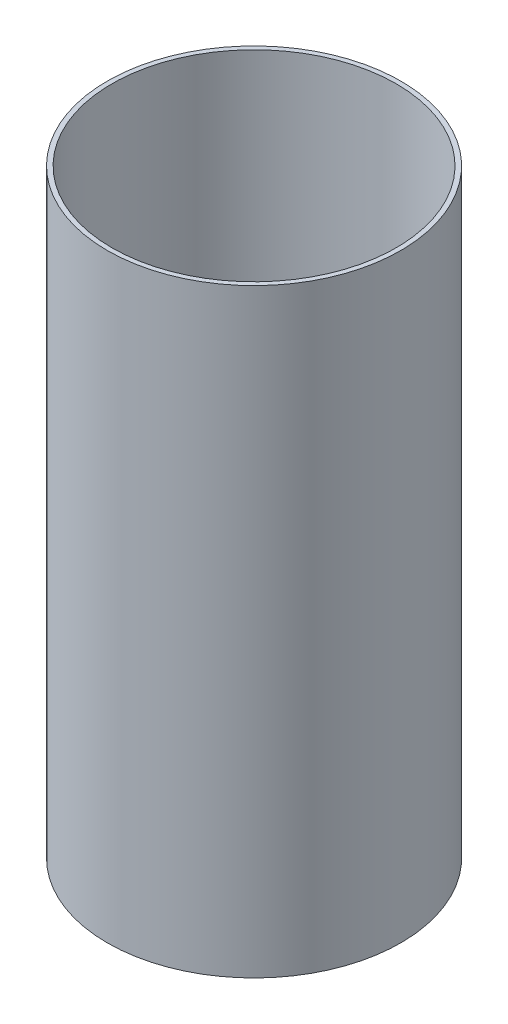
ISO-10303-21;
HEADER;
FILE_DESCRIPTION(('STEP AP214'),'2;1');
FILE_NAME('part.step','',(''),(''),'','','');
FILE_SCHEMA(('AUTOMOTIVE_DESIGN { 1 0 10303 214 1 1 1 1 }'));
ENDSEC;
DATA;
#1=APPLICATION_CONTEXT('core data for automotive mechanical design processes');
#2=APPLICATION_PROTOCOL_DEFINITION('international standard','automotive_design',2000,#1);
#3=PRODUCT_CONTEXT('',#1,'mechanical');
#4=PRODUCT('Part','Part','',(#3));
#5=PRODUCT_RELATED_PRODUCT_CATEGORY('part','',(#4));
#6=PRODUCT_DEFINITION_FORMATION('','',#4);
#7=PRODUCT_DEFINITION_CONTEXT('part definition',#1,'design');
#8=PRODUCT_DEFINITION('design','',#6,#7);
#9=PRODUCT_DEFINITION_SHAPE('','',#8);
#10=(LENGTH_UNIT() NAMED_UNIT(*) SI_UNIT(.MILLI.,.METRE.));
#11=(NAMED_UNIT(*) PLANE_ANGLE_UNIT() SI_UNIT($,.RADIAN.));
#12=(NAMED_UNIT(*) SI_UNIT($,.STERADIAN.) SOLID_ANGLE_UNIT());
#13=UNCERTAINTY_MEASURE_WITH_UNIT(LENGTH_MEASURE(1.E-05),#10,'distance_accuracy_value','');
#14=(GEOMETRIC_REPRESENTATION_CONTEXT(3) GLOBAL_UNCERTAINTY_ASSIGNED_CONTEXT((#13)) GLOBAL_UNIT_ASSIGNED_CONTEXT((#10,
#11,#12)) REPRESENTATION_CONTEXT('',''));
#15=CARTESIAN_POINT('',(0.,0.,0.));
#16=DIRECTION('',(0.,0.,1.));
#17=DIRECTION('',(1.,0.,0.));
#18=AXIS2_PLACEMENT_3D('',#15,#16,#17);
#19=CARTESIAN_POINT('',(0.,212.725,0.));
#20=DIRECTION('',(0.,1.,0.));
#21=DIRECTION('',(0.,0.,1.));
#22=AXIS2_PLACEMENT_3D('',#19,#20,#21);
#23=PLANE('',#22);
#24=CARTESIAN_POINT('',(0.,212.725,0.));
#25=DIRECTION('',(0.,1.,0.));
#26=DIRECTION('',(0.,0.,1.));
#27=AXIS2_PLACEMENT_3D('',#24,#25,#26);
#28=CIRCLE('',#27,104.14);
#29=CARTESIAN_POINT('',(0.,212.725,104.14));
#30=VERTEX_POINT('',#29);
#31=EDGE_CURVE('E10',#30,#30,#28,.T.);
#32=ORIENTED_EDGE('',*,*,#31,.T.);
#33=EDGE_LOOP('',(#32));
#34=FACE_BOUND('',#33,.T.);
#35=CARTESIAN_POINT('',(0.,212.725,0.));
#36=DIRECTION('',(0.,1.,0.));
#37=DIRECTION('',(0.,0.,1.));
#38=AXIS2_PLACEMENT_3D('',#35,#36,#37);
#39=CIRCLE('',#38,100.838);
#40=CARTESIAN_POINT('',(0.,212.725,100.838));
#41=VERTEX_POINT('',#40);
#42=EDGE_CURVE('E50',#41,#41,#39,.T.);
#43=ORIENTED_EDGE('',*,*,#42,.F.);
#44=EDGE_LOOP('',(#43));
#45=FACE_BOUND('',#44,.T.);
#46=ADVANCED_FACE('F39',(#34,#45),#23,.T.);
#47=CARTESIAN_POINT('',(0.,-212.725,0.));
#48=DIRECTION('',(0.,1.,0.));
#49=DIRECTION('',(0.,0.,1.));
#50=AXIS2_PLACEMENT_3D('',#47,#48,#49);
#51=PLANE('',#50);
#52=CARTESIAN_POINT('',(0.,-212.725,0.));
#53=DIRECTION('',(0.,1.,0.));
#54=DIRECTION('',(0.,0.,1.));
#55=AXIS2_PLACEMENT_3D('',#52,#53,#54);
#56=CIRCLE('',#55,104.14);
#57=CARTESIAN_POINT('',(0.,-212.725,104.14));
#58=VERTEX_POINT('',#57);
#59=EDGE_CURVE('E43',#58,#58,#56,.T.);
#60=ORIENTED_EDGE('',*,*,#59,.F.);
#61=EDGE_LOOP('',(#60));
#62=FACE_BOUND('',#61,.T.);
#63=CARTESIAN_POINT('',(0.,-212.725,0.));
#64=DIRECTION('',(0.,1.,0.));
#65=DIRECTION('',(0.,0.,1.));
#66=AXIS2_PLACEMENT_3D('',#63,#64,#65);
#67=CIRCLE('',#66,100.838);
#68=CARTESIAN_POINT('',(0.,-212.725,100.838));
#69=VERTEX_POINT('',#68);
#70=EDGE_CURVE('E52',#69,#69,#67,.T.);
#71=ORIENTED_EDGE('',*,*,#70,.T.);
#72=EDGE_LOOP('',(#71));
#73=FACE_BOUND('',#72,.T.);
#74=ADVANCED_FACE('F62',(#62,#73),#51,.F.);
#75=CARTESIAN_POINT('',(0.,212.725,0.));
#76=DIRECTION('',(0.,-1.,0.));
#77=DIRECTION('',(0.,0.,-1.));
#78=AXIS2_PLACEMENT_3D('',#75,#76,#77);
#79=CYLINDRICAL_SURFACE('',#78,104.14);
#80=ORIENTED_EDGE('',*,*,#31,.F.);
#81=EDGE_LOOP('',(#80));
#82=FACE_BOUND('',#81,.T.);
#83=ORIENTED_EDGE('',*,*,#59,.T.);
#84=EDGE_LOOP('',(#83));
#85=FACE_BOUND('',#84,.T.);
#86=ADVANCED_FACE('F41',(#82,#85),#79,.T.);
#87=CARTESIAN_POINT('',(0.,212.725,0.));
#88=DIRECTION('',(0.,-1.,0.));
#89=DIRECTION('',(0.,0.,-1.));
#90=AXIS2_PLACEMENT_3D('',#87,#88,#89);
#91=CYLINDRICAL_SURFACE('',#90,100.838);
#92=ORIENTED_EDGE('',*,*,#42,.T.);
#93=EDGE_LOOP('',(#92));
#94=FACE_BOUND('',#93,.T.);
#95=ORIENTED_EDGE('',*,*,#70,.F.);
#96=EDGE_LOOP('',(#95));
#97=FACE_BOUND('',#96,.T.);
#98=ADVANCED_FACE('F58',(#94,#97),#91,.F.);
#99=CLOSED_SHELL('',(#46,#74,#86,#98));
#100=MANIFOLD_SOLID_BREP('B2',#99);
#101=ADVANCED_BREP_SHAPE_REPRESENTATION('',(#18,#100),#14);
#102=SHAPE_DEFINITION_REPRESENTATION(#9,#101);
ENDSEC;
END-ISO-10303-21;
